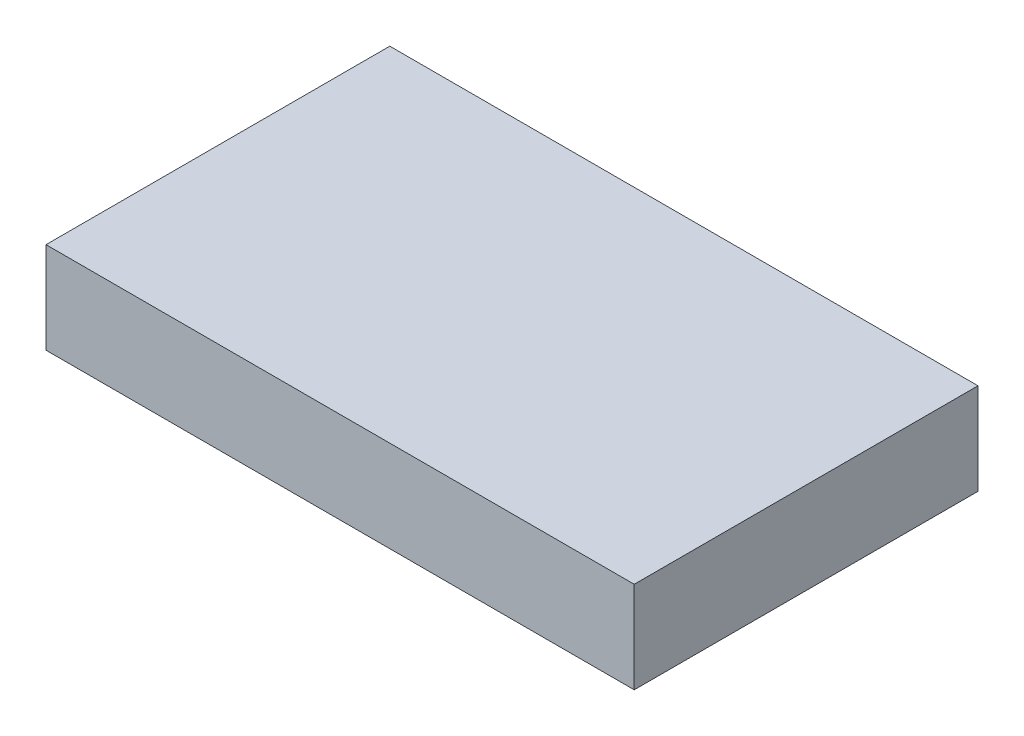
ISO-10303-21;
HEADER;
FILE_DESCRIPTION(('STEP AP214'),'2;1');
FILE_NAME('part.step','',(''),(''),'','','');
FILE_SCHEMA(('AUTOMOTIVE_DESIGN { 1 0 10303 214 1 1 1 1 }'));
ENDSEC;
DATA;
#1=APPLICATION_CONTEXT('core data for automotive mechanical design processes');
#2=APPLICATION_PROTOCOL_DEFINITION('international standard','automotive_design',2000,#1);
#3=PRODUCT_CONTEXT('',#1,'mechanical');
#4=PRODUCT('Part','Part','',(#3));
#5=PRODUCT_RELATED_PRODUCT_CATEGORY('part','',(#4));
#6=PRODUCT_DEFINITION_FORMATION('','',#4);
#7=PRODUCT_DEFINITION_CONTEXT('part definition',#1,'design');
#8=PRODUCT_DEFINITION('design','',#6,#7);
#9=PRODUCT_DEFINITION_SHAPE('','',#8);
#10=(LENGTH_UNIT() NAMED_UNIT(*) SI_UNIT(.MILLI.,.METRE.));
#11=(NAMED_UNIT(*) PLANE_ANGLE_UNIT() SI_UNIT($,.RADIAN.));
#12=(NAMED_UNIT(*) SI_UNIT($,.STERADIAN.) SOLID_ANGLE_UNIT());
#13=UNCERTAINTY_MEASURE_WITH_UNIT(LENGTH_MEASURE(1.E-05),#10,'distance_accuracy_value','');
#14=(GEOMETRIC_REPRESENTATION_CONTEXT(3) GLOBAL_UNCERTAINTY_ASSIGNED_CONTEXT((#13)) GLOBAL_UNIT_ASSIGNED_CONTEXT((#10,
#11,#12)) REPRESENTATION_CONTEXT('',''));
#15=CARTESIAN_POINT('',(0.,0.,0.));
#16=DIRECTION('',(0.,0.,1.));
#17=DIRECTION('',(1.,0.,0.));
#18=AXIS2_PLACEMENT_3D('',#15,#16,#17);
#19=CARTESIAN_POINT('',(-71.0027393198535,18.542,-38.8596073304604));
#20=DIRECTION('',(1.,0.,0.));
#21=DIRECTION('',(0.,0.,-1.));
#22=AXIS2_PLACEMENT_3D('',#19,#20,#21);
#23=PLANE('',#22);
#24=DIRECTION('',(0.,0.,1.));
#25=VECTOR('',#24,1.);
#26=CARTESIAN_POINT('',(-71.0027393198535,0.,-38.8596073304604));
#27=LINE('',#26,#25);
#28=CARTESIAN_POINT('',(-71.0027393198535,0.,-38.8596073304604));
#29=VERTEX_POINT('',#28);
#30=CARTESIAN_POINT('',(-71.0027393198535,0.,30.8638033529994));
#31=VERTEX_POINT('',#30);
#32=EDGE_CURVE('E99',#29,#31,#27,.T.);
#33=ORIENTED_EDGE('',*,*,#32,.T.);
#34=DIRECTION('',(0.,-1.,0.));
#35=VECTOR('',#34,1.);
#36=CARTESIAN_POINT('',(-71.0027393198535,18.542,30.8638033529994));
#37=LINE('',#36,#35);
#38=CARTESIAN_POINT('',(-71.0027393198535,18.542,30.8638033529994));
#39=VERTEX_POINT('',#38);
#40=EDGE_CURVE('E11',#39,#31,#37,.T.);
#41=ORIENTED_EDGE('',*,*,#40,.F.);
#42=DIRECTION('',(0.,0.,1.));
#43=VECTOR('',#42,1.);
#44=CARTESIAN_POINT('',(-71.0027393198535,18.542,-38.8596073304604));
#45=LINE('',#44,#43);
#46=CARTESIAN_POINT('',(-71.0027393198535,18.542,-38.8596073304604));
#47=VERTEX_POINT('',#46);
#48=EDGE_CURVE('E87',#47,#39,#45,.T.);
#49=ORIENTED_EDGE('',*,*,#48,.F.);
#50=DIRECTION('',(0.,-1.,0.));
#51=VECTOR('',#50,1.);
#52=CARTESIAN_POINT('',(-71.0027393198535,18.542,-38.8596073304604));
#53=LINE('',#52,#51);
#54=EDGE_CURVE('E95',#47,#29,#53,.T.);
#55=ORIENTED_EDGE('',*,*,#54,.T.);
#56=EDGE_LOOP('',(#33,#41,#49,#55));
#57=FACE_BOUND('',#56,.T.);
#58=ADVANCED_FACE('F36',(#57),#23,.F.);
#59=CARTESIAN_POINT('',(-71.0027393198535,18.542,30.8638033529994));
#60=DIRECTION('',(0.,0.,-1.));
#61=DIRECTION('',(-1.,0.,0.));
#62=AXIS2_PLACEMENT_3D('',#59,#60,#61);
#63=PLANE('',#62);
#64=DIRECTION('',(1.,0.,0.));
#65=VECTOR('',#64,1.);
#66=CARTESIAN_POINT('',(-71.0027393198535,0.,30.8638033529994));
#67=LINE('',#66,#65);
#68=CARTESIAN_POINT('',(48.2946560238643,0.,30.8638033529994));
#69=VERTEX_POINT('',#68);
#70=EDGE_CURVE('E91',#31,#69,#67,.T.);
#71=ORIENTED_EDGE('',*,*,#70,.T.);
#72=DIRECTION('',(0.,-1.,0.));
#73=VECTOR('',#72,1.);
#74=CARTESIAN_POINT('',(48.2946560238643,18.542,30.8638033529994));
#75=LINE('',#74,#73);
#76=CARTESIAN_POINT('',(48.2946560238643,18.542,30.8638033529994));
#77=VERTEX_POINT('',#76);
#78=EDGE_CURVE('E44',#77,#69,#75,.T.);
#79=ORIENTED_EDGE('',*,*,#78,.F.);
#80=DIRECTION('',(1.,0.,0.));
#81=VECTOR('',#80,1.);
#82=CARTESIAN_POINT('',(-71.0027393198535,18.542,30.8638033529994));
#83=LINE('',#82,#81);
#84=EDGE_CURVE('E82',#39,#77,#83,.T.);
#85=ORIENTED_EDGE('',*,*,#84,.F.);
#86=ORIENTED_EDGE('',*,*,#40,.T.);
#87=EDGE_LOOP('',(#71,#79,#85,#86));
#88=FACE_BOUND('',#87,.T.);
#89=ADVANCED_FACE('F90',(#88),#63,.F.);
#90=CARTESIAN_POINT('',(48.2946560238643,18.542,-38.8596073304604));
#91=DIRECTION('',(-1.,0.,0.));
#92=DIRECTION('',(0.,0.,1.));
#93=AXIS2_PLACEMENT_3D('',#90,#91,#92);
#94=PLANE('',#93);
#95=DIRECTION('',(0.,0.,-1.));
#96=VECTOR('',#95,1.);
#97=CARTESIAN_POINT('',(48.2946560238643,0.,-38.8596073304604));
#98=LINE('',#97,#96);
#99=CARTESIAN_POINT('',(48.2946560238643,0.,-38.8596073304604));
#100=VERTEX_POINT('',#99);
#101=EDGE_CURVE('E69',#69,#100,#98,.T.);
#102=ORIENTED_EDGE('',*,*,#101,.T.);
#103=DIRECTION('',(0.,-1.,0.));
#104=VECTOR('',#103,1.);
#105=CARTESIAN_POINT('',(48.2946560238643,18.542,-38.8596073304604));
#106=LINE('',#105,#104);
#107=CARTESIAN_POINT('',(48.2946560238643,18.542,-38.8596073304604));
#108=VERTEX_POINT('',#107);
#109=EDGE_CURVE('E92',#108,#100,#106,.T.);
#110=ORIENTED_EDGE('',*,*,#109,.F.);
#111=DIRECTION('',(0.,0.,-1.));
#112=VECTOR('',#111,1.);
#113=CARTESIAN_POINT('',(48.2946560238643,18.542,-38.8596073304604));
#114=LINE('',#113,#112);
#115=EDGE_CURVE('E85',#77,#108,#114,.T.);
#116=ORIENTED_EDGE('',*,*,#115,.F.);
#117=ORIENTED_EDGE('',*,*,#78,.T.);
#118=EDGE_LOOP('',(#102,#110,#116,#117));
#119=FACE_BOUND('',#118,.T.);
#120=ADVANCED_FACE('F93',(#119),#94,.F.);
#121=CARTESIAN_POINT('',(-71.0027393198535,18.542,-38.8596073304604));
#122=DIRECTION('',(0.,0.,1.));
#123=DIRECTION('',(1.,0.,0.));
#124=AXIS2_PLACEMENT_3D('',#121,#122,#123);
#125=PLANE('',#124);
#126=DIRECTION('',(-1.,0.,0.));
#127=VECTOR('',#126,1.);
#128=CARTESIAN_POINT('',(-71.0027393198535,0.,-38.8596073304604));
#129=LINE('',#128,#127);
#130=EDGE_CURVE('E75',#100,#29,#129,.T.);
#131=ORIENTED_EDGE('',*,*,#130,.T.);
#132=ORIENTED_EDGE('',*,*,#54,.F.);
#133=DIRECTION('',(-1.,0.,0.));
#134=VECTOR('',#133,1.);
#135=CARTESIAN_POINT('',(-71.0027393198535,18.542,-38.8596073304604));
#136=LINE('',#135,#134);
#137=EDGE_CURVE('E52',#108,#47,#136,.T.);
#138=ORIENTED_EDGE('',*,*,#137,.F.);
#139=ORIENTED_EDGE('',*,*,#109,.T.);
#140=EDGE_LOOP('',(#131,#132,#138,#139));
#141=FACE_BOUND('',#140,.T.);
#142=ADVANCED_FACE('F106',(#141),#125,.F.);
#143=CARTESIAN_POINT('',(0.,18.542,0.));
#144=DIRECTION('',(0.,1.,0.));
#145=DIRECTION('',(0.,0.,1.));
#146=AXIS2_PLACEMENT_3D('',#143,#144,#145);
#147=PLANE('',#146);
#148=ORIENTED_EDGE('',*,*,#48,.T.);
#149=ORIENTED_EDGE('',*,*,#84,.T.);
#150=ORIENTED_EDGE('',*,*,#115,.T.);
#151=ORIENTED_EDGE('',*,*,#137,.T.);
#152=EDGE_LOOP('',(#148,#149,#150,#151));
#153=FACE_BOUND('',#152,.T.);
#154=ADVANCED_FACE('F83',(#153),#147,.T.);
#155=CARTESIAN_POINT('',(0.,0.,0.));
#156=DIRECTION('',(0.,1.,0.));
#157=DIRECTION('',(0.,0.,1.));
#158=AXIS2_PLACEMENT_3D('',#155,#156,#157);
#159=PLANE('',#158);
#160=ORIENTED_EDGE('',*,*,#32,.F.);
#161=ORIENTED_EDGE('',*,*,#130,.F.);
#162=ORIENTED_EDGE('',*,*,#101,.F.);
#163=ORIENTED_EDGE('',*,*,#70,.F.);
#164=EDGE_LOOP('',(#160,#161,#162,#163));
#165=FACE_BOUND('',#164,.T.);
#166=ADVANCED_FACE('F109',(#165),#159,.F.);
#167=CLOSED_SHELL('',(#58,#89,#120,#142,#154,#166));
#168=MANIFOLD_SOLID_BREP('B2',#167);
#169=ADVANCED_BREP_SHAPE_REPRESENTATION('',(#18,#168),#14);
#170=SHAPE_DEFINITION_REPRESENTATION(#9,#169);
ENDSEC;
END-ISO-10303-21;
